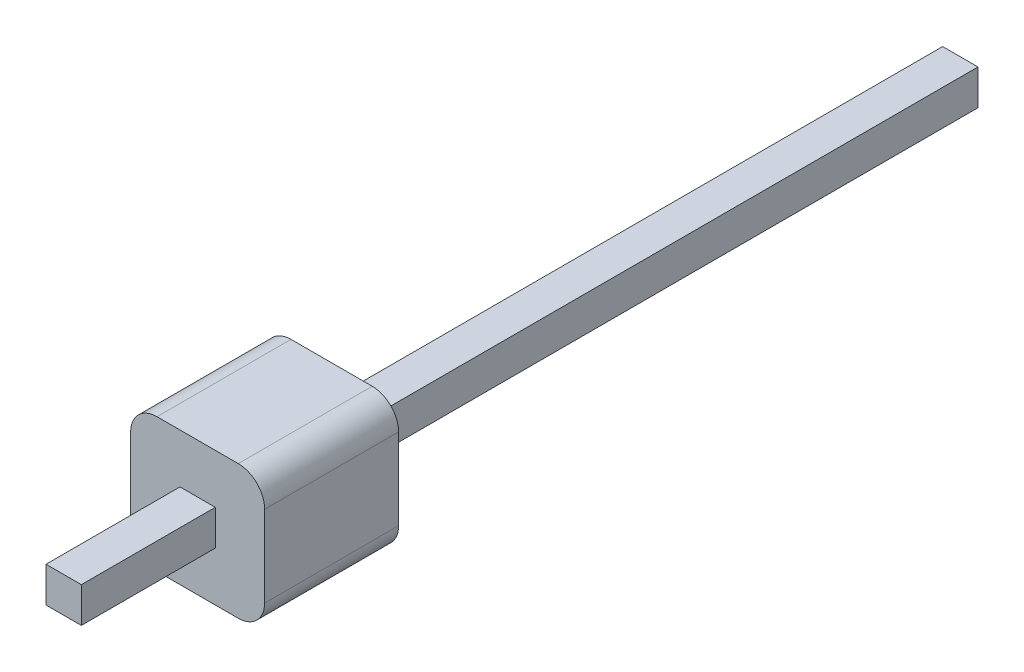
ISO-10303-21;
HEADER;
FILE_DESCRIPTION(('STEP AP214'),'2;1');
FILE_NAME('part.step','',(''),(''),'','','');
FILE_SCHEMA(('AUTOMOTIVE_DESIGN { 1 0 10303 214 1 1 1 1 }'));
ENDSEC;
DATA;
#1=APPLICATION_CONTEXT('core data for automotive mechanical design processes');
#2=APPLICATION_PROTOCOL_DEFINITION('international standard','automotive_design',2000,#1);
#3=PRODUCT_CONTEXT('',#1,'mechanical');
#4=PRODUCT('Part','Part','',(#3));
#5=PRODUCT_RELATED_PRODUCT_CATEGORY('part','',(#4));
#6=PRODUCT_DEFINITION_FORMATION('','',#4);
#7=PRODUCT_DEFINITION_CONTEXT('part definition',#1,'design');
#8=PRODUCT_DEFINITION('design','',#6,#7);
#9=PRODUCT_DEFINITION_SHAPE('','',#8);
#10=(LENGTH_UNIT() NAMED_UNIT(*) SI_UNIT(.MILLI.,.METRE.));
#11=(NAMED_UNIT(*) PLANE_ANGLE_UNIT() SI_UNIT($,.RADIAN.));
#12=(NAMED_UNIT(*) SI_UNIT($,.STERADIAN.) SOLID_ANGLE_UNIT());
#13=UNCERTAINTY_MEASURE_WITH_UNIT(LENGTH_MEASURE(1.E-05),#10,'distance_accuracy_value','');
#14=(GEOMETRIC_REPRESENTATION_CONTEXT(3) GLOBAL_UNCERTAINTY_ASSIGNED_CONTEXT((#13)) GLOBAL_UNIT_ASSIGNED_CONTEXT((#10,
#11,#12)) REPRESENTATION_CONTEXT('',''));
#15=CARTESIAN_POINT('',(0.,0.,0.));
#16=DIRECTION('',(0.,0.,1.));
#17=DIRECTION('',(1.,0.,0.));
#18=AXIS2_PLACEMENT_3D('',#15,#16,#17);
#19=CARTESIAN_POINT('',(-1.27,1.27,2.54));
#20=DIRECTION('',(0.,0.,1.));
#21=DIRECTION('',(1.,0.,0.));
#22=AXIS2_PLACEMENT_3D('',#19,#20,#21);
#23=PLANE('',#22);
#24=DIRECTION('',(1.,0.,0.));
#25=VECTOR('',#24,1.);
#26=CARTESIAN_POINT('',(-1.27,-1.27,2.54));
#27=LINE('',#26,#25);
#28=CARTESIAN_POINT('',(-0.769999999999999,-1.27,2.54));
#29=VERTEX_POINT('',#28);
#30=CARTESIAN_POINT('',(0.770000000000001,-1.27,2.54));
#31=VERTEX_POINT('',#30);
#32=EDGE_CURVE('E193',#29,#31,#27,.T.);
#33=ORIENTED_EDGE('',*,*,#32,.T.);
#34=CARTESIAN_POINT('',(0.770000000000001,-0.770000000000001,2.54));
#35=DIRECTION('',(0.,0.,1.));
#36=DIRECTION('',(1.,0.,0.));
#37=AXIS2_PLACEMENT_3D('',#34,#35,#36);
#38=CIRCLE('',#37,0.5);
#39=CARTESIAN_POINT('',(1.27,-0.77,2.54));
#40=VERTEX_POINT('',#39);
#41=EDGE_CURVE('E242',#31,#40,#38,.T.);
#42=ORIENTED_EDGE('',*,*,#41,.T.);
#43=DIRECTION('',(0.,1.,0.));
#44=VECTOR('',#43,1.);
#45=CARTESIAN_POINT('',(1.27,1.27,2.54));
#46=LINE('',#45,#44);
#47=CARTESIAN_POINT('',(1.27,0.77,2.54));
#48=VERTEX_POINT('',#47);
#49=EDGE_CURVE('E197',#40,#48,#46,.T.);
#50=ORIENTED_EDGE('',*,*,#49,.T.);
#51=CARTESIAN_POINT('',(0.77,0.77,2.54));
#52=DIRECTION('',(0.,0.,1.));
#53=DIRECTION('',(1.,0.,0.));
#54=AXIS2_PLACEMENT_3D('',#51,#52,#53);
#55=CIRCLE('',#54,0.5);
#56=CARTESIAN_POINT('',(0.77,1.27,2.54));
#57=VERTEX_POINT('',#56);
#58=EDGE_CURVE('E54',#48,#57,#55,.T.);
#59=ORIENTED_EDGE('',*,*,#58,.T.);
#60=DIRECTION('',(-1.,0.,0.));
#61=VECTOR('',#60,1.);
#62=CARTESIAN_POINT('',(-1.27,1.27,2.54));
#63=LINE('',#62,#61);
#64=CARTESIAN_POINT('',(-0.77,1.27,2.54));
#65=VERTEX_POINT('',#64);
#66=EDGE_CURVE('E199',#57,#65,#63,.T.);
#67=ORIENTED_EDGE('',*,*,#66,.T.);
#68=CARTESIAN_POINT('',(-0.77,0.769999999999999,2.54));
#69=DIRECTION('',(0.,0.,1.));
#70=DIRECTION('',(1.,0.,0.));
#71=AXIS2_PLACEMENT_3D('',#68,#69,#70);
#72=CIRCLE('',#71,0.5);
#73=CARTESIAN_POINT('',(-1.27,0.769999999999999,2.54));
#74=VERTEX_POINT('',#73);
#75=EDGE_CURVE('E238',#65,#74,#72,.T.);
#76=ORIENTED_EDGE('',*,*,#75,.T.);
#77=DIRECTION('',(0.,-1.,0.));
#78=VECTOR('',#77,1.);
#79=CARTESIAN_POINT('',(-1.27,1.27,2.54));
#80=LINE('',#79,#78);
#81=CARTESIAN_POINT('',(-1.27,-0.770000000000001,2.54));
#82=VERTEX_POINT('',#81);
#83=EDGE_CURVE('E190',#74,#82,#80,.T.);
#84=ORIENTED_EDGE('',*,*,#83,.T.);
#85=CARTESIAN_POINT('',(-0.769999999999999,-0.770000000000001,2.54));
#86=DIRECTION('',(0.,0.,1.));
#87=DIRECTION('',(1.,0.,0.));
#88=AXIS2_PLACEMENT_3D('',#85,#86,#87);
#89=CIRCLE('',#88,0.5);
#90=EDGE_CURVE('E240',#82,#29,#89,.T.);
#91=ORIENTED_EDGE('',*,*,#90,.T.);
#92=EDGE_LOOP('',(#33,#42,#50,#59,#67,#76,#84,#91));
#93=FACE_BOUND('',#92,.T.);
#94=DIRECTION('',(1.,0.,0.));
#95=VECTOR('',#94,1.);
#96=CARTESIAN_POINT('',(-1.27,0.335000000000001,2.54));
#97=LINE('',#96,#95);
#98=CARTESIAN_POINT('',(-0.335,0.335000000000001,2.54));
#99=VERTEX_POINT('',#98);
#100=CARTESIAN_POINT('',(0.335,0.335,2.54));
#101=VERTEX_POINT('',#100);
#102=EDGE_CURVE('E172',#99,#101,#97,.T.);
#103=ORIENTED_EDGE('',*,*,#102,.T.);
#104=DIRECTION('',(0.,-1.,0.));
#105=VECTOR('',#104,1.);
#106=CARTESIAN_POINT('',(0.335000000000001,1.27,2.54));
#107=LINE('',#106,#105);
#108=CARTESIAN_POINT('',(0.334999999999999,-0.334999999999999,2.54));
#109=VERTEX_POINT('',#108);
#110=EDGE_CURVE('E186',#101,#109,#107,.T.);
#111=ORIENTED_EDGE('',*,*,#110,.T.);
#112=DIRECTION('',(-1.,0.,0.));
#113=VECTOR('',#112,1.);
#114=CARTESIAN_POINT('',(-1.27,-0.335,2.54));
#115=LINE('',#114,#113);
#116=CARTESIAN_POINT('',(-0.335,-0.334999999999999,2.54));
#117=VERTEX_POINT('',#116);
#118=EDGE_CURVE('E183',#109,#117,#115,.T.);
#119=ORIENTED_EDGE('',*,*,#118,.T.);
#120=DIRECTION('',(0.,1.,0.));
#121=VECTOR('',#120,1.);
#122=CARTESIAN_POINT('',(-0.335,1.27,2.54));
#123=LINE('',#122,#121);
#124=EDGE_CURVE('E176',#117,#99,#123,.T.);
#125=ORIENTED_EDGE('',*,*,#124,.T.);
#126=EDGE_LOOP('',(#103,#111,#119,#125));
#127=FACE_BOUND('',#126,.T.);
#128=ADVANCED_FACE('F34',(#93,#127),#23,.T.);
#129=CARTESIAN_POINT('',(-1.27,1.27,0.));
#130=DIRECTION('',(0.,0.,1.));
#131=DIRECTION('',(1.,0.,0.));
#132=AXIS2_PLACEMENT_3D('',#129,#130,#131);
#133=PLANE('',#132);
#134=DIRECTION('',(0.,1.,0.));
#135=VECTOR('',#134,1.);
#136=CARTESIAN_POINT('',(1.27,1.27,0.));
#137=LINE('',#136,#135);
#138=CARTESIAN_POINT('',(1.27,-0.77,0.));
#139=VERTEX_POINT('',#138);
#140=CARTESIAN_POINT('',(1.27,0.77,0.));
#141=VERTEX_POINT('',#140);
#142=EDGE_CURVE('E207',#139,#141,#137,.T.);
#143=ORIENTED_EDGE('',*,*,#142,.F.);
#144=CARTESIAN_POINT('',(0.770000000000001,-0.770000000000001,0.));
#145=DIRECTION('',(0.,0.,1.));
#146=DIRECTION('',(1.,0.,0.));
#147=AXIS2_PLACEMENT_3D('',#144,#145,#146);
#148=CIRCLE('',#147,0.5);
#149=CARTESIAN_POINT('',(0.770000000000001,-1.27,0.));
#150=VERTEX_POINT('',#149);
#151=EDGE_CURVE('E230',#139,#150,#148,.F.);
#152=ORIENTED_EDGE('',*,*,#151,.T.);
#153=DIRECTION('',(1.,0.,0.));
#154=VECTOR('',#153,1.);
#155=CARTESIAN_POINT('',(-1.27,-1.27,0.));
#156=LINE('',#155,#154);
#157=CARTESIAN_POINT('',(-0.769999999999999,-1.27,0.));
#158=VERTEX_POINT('',#157);
#159=EDGE_CURVE('E204',#158,#150,#156,.T.);
#160=ORIENTED_EDGE('',*,*,#159,.F.);
#161=CARTESIAN_POINT('',(-0.769999999999999,-0.770000000000001,0.));
#162=DIRECTION('',(0.,0.,1.));
#163=DIRECTION('',(1.,0.,0.));
#164=AXIS2_PLACEMENT_3D('',#161,#162,#163);
#165=CIRCLE('',#164,0.5);
#166=CARTESIAN_POINT('',(-1.27,-0.770000000000001,0.));
#167=VERTEX_POINT('',#166);
#168=EDGE_CURVE('E228',#158,#167,#165,.F.);
#169=ORIENTED_EDGE('',*,*,#168,.T.);
#170=DIRECTION('',(0.,-1.,0.));
#171=VECTOR('',#170,1.);
#172=CARTESIAN_POINT('',(-1.27,1.27,0.));
#173=LINE('',#172,#171);
#174=CARTESIAN_POINT('',(-1.27,0.769999999999999,0.));
#175=VERTEX_POINT('',#174);
#176=EDGE_CURVE('E189',#175,#167,#173,.T.);
#177=ORIENTED_EDGE('',*,*,#176,.F.);
#178=CARTESIAN_POINT('',(-0.77,0.769999999999999,0.));
#179=DIRECTION('',(0.,0.,1.));
#180=DIRECTION('',(1.,0.,0.));
#181=AXIS2_PLACEMENT_3D('',#178,#179,#180);
#182=CIRCLE('',#181,0.5);
#183=CARTESIAN_POINT('',(-0.77,1.27,0.));
#184=VERTEX_POINT('',#183);
#185=EDGE_CURVE('E226',#175,#184,#182,.F.);
#186=ORIENTED_EDGE('',*,*,#185,.T.);
#187=DIRECTION('',(-1.,0.,0.));
#188=VECTOR('',#187,1.);
#189=CARTESIAN_POINT('',(-1.27,1.27,0.));
#190=LINE('',#189,#188);
#191=CARTESIAN_POINT('',(0.77,1.27,0.));
#192=VERTEX_POINT('',#191);
#193=EDGE_CURVE('E194',#192,#184,#190,.T.);
#194=ORIENTED_EDGE('',*,*,#193,.F.);
#195=CARTESIAN_POINT('',(0.77,0.77,0.));
#196=DIRECTION('',(0.,0.,1.));
#197=DIRECTION('',(1.,0.,0.));
#198=AXIS2_PLACEMENT_3D('',#195,#196,#197);
#199=CIRCLE('',#198,0.5);
#200=EDGE_CURVE('E224',#192,#141,#199,.F.);
#201=ORIENTED_EDGE('',*,*,#200,.T.);
#202=EDGE_LOOP('',(#143,#152,#160,#169,#177,#186,#194,#201));
#203=FACE_BOUND('',#202,.T.);
#204=DIRECTION('',(0.,-1.,0.));
#205=VECTOR('',#204,1.);
#206=CARTESIAN_POINT('',(0.335000000000001,1.27,0.));
#207=LINE('',#206,#205);
#208=CARTESIAN_POINT('',(0.335,0.335000000000001,0.));
#209=VERTEX_POINT('',#208);
#210=CARTESIAN_POINT('',(0.334999999999999,-0.334999999999999,0.));
#211=VERTEX_POINT('',#210);
#212=EDGE_CURVE('E171',#209,#211,#207,.T.);
#213=ORIENTED_EDGE('',*,*,#212,.F.);
#214=DIRECTION('',(1.,0.,0.));
#215=VECTOR('',#214,1.);
#216=CARTESIAN_POINT('',(-1.27,0.335000000000001,0.));
#217=LINE('',#216,#215);
#218=CARTESIAN_POINT('',(-0.335,0.335000000000001,0.));
#219=VERTEX_POINT('',#218);
#220=EDGE_CURVE('E201',#219,#209,#217,.T.);
#221=ORIENTED_EDGE('',*,*,#220,.F.);
#222=DIRECTION('',(0.,1.,0.));
#223=VECTOR('',#222,1.);
#224=CARTESIAN_POINT('',(-0.335,1.27,0.));
#225=LINE('',#224,#223);
#226=CARTESIAN_POINT('',(-0.335,-0.335,0.));
#227=VERTEX_POINT('',#226);
#228=EDGE_CURVE('E213',#227,#219,#225,.T.);
#229=ORIENTED_EDGE('',*,*,#228,.F.);
#230=DIRECTION('',(-1.,0.,0.));
#231=VECTOR('',#230,1.);
#232=CARTESIAN_POINT('',(-1.27,-0.334999999999999,0.));
#233=LINE('',#232,#231);
#234=EDGE_CURVE('E216',#211,#227,#233,.T.);
#235=ORIENTED_EDGE('',*,*,#234,.F.);
#236=EDGE_LOOP('',(#213,#221,#229,#235));
#237=FACE_BOUND('',#236,.T.);
#238=ADVANCED_FACE('F255',(#203,#237),#133,.F.);
#239=CARTESIAN_POINT('',(-1.27,1.27,2.54));
#240=DIRECTION('',(1.,0.,0.));
#241=DIRECTION('',(0.,1.,0.));
#242=AXIS2_PLACEMENT_3D('',#239,#240,#241);
#243=PLANE('',#242);
#244=ORIENTED_EDGE('',*,*,#176,.T.);
#245=DIRECTION('',(0.,0.,-1.));
#246=VECTOR('',#245,1.);
#247=CARTESIAN_POINT('',(-1.27,-0.770000000000001,2.54));
#248=LINE('',#247,#246);
#249=EDGE_CURVE('E247',#167,#82,#248,.F.);
#250=ORIENTED_EDGE('',*,*,#249,.T.);
#251=ORIENTED_EDGE('',*,*,#83,.F.);
#252=DIRECTION('',(0.,0.,-1.));
#253=VECTOR('',#252,1.);
#254=CARTESIAN_POINT('',(-1.27,0.769999999999999,2.54));
#255=LINE('',#254,#253);
#256=EDGE_CURVE('E244',#74,#175,#255,.T.);
#257=ORIENTED_EDGE('',*,*,#256,.T.);
#258=EDGE_LOOP('',(#244,#250,#251,#257));
#259=FACE_BOUND('',#258,.T.);
#260=ADVANCED_FACE('F264',(#259),#243,.F.);
#261=CARTESIAN_POINT('',(-1.27,-1.27,2.54));
#262=DIRECTION('',(0.,1.,0.));
#263=DIRECTION('',(-1.,0.,0.));
#264=AXIS2_PLACEMENT_3D('',#261,#262,#263);
#265=PLANE('',#264);
#266=ORIENTED_EDGE('',*,*,#159,.T.);
#267=DIRECTION('',(0.,0.,-1.));
#268=VECTOR('',#267,1.);
#269=CARTESIAN_POINT('',(0.770000000000001,-1.27,2.54));
#270=LINE('',#269,#268);
#271=EDGE_CURVE('E235',#150,#31,#270,.F.);
#272=ORIENTED_EDGE('',*,*,#271,.T.);
#273=ORIENTED_EDGE('',*,*,#32,.F.);
#274=DIRECTION('',(0.,0.,-1.));
#275=VECTOR('',#274,1.);
#276=CARTESIAN_POINT('',(-0.769999999999999,-1.27,2.54));
#277=LINE('',#276,#275);
#278=EDGE_CURVE('E232',#29,#158,#277,.T.);
#279=ORIENTED_EDGE('',*,*,#278,.T.);
#280=EDGE_LOOP('',(#266,#272,#273,#279));
#281=FACE_BOUND('',#280,.T.);
#282=ADVANCED_FACE('F274',(#281),#265,.F.);
#283=CARTESIAN_POINT('',(1.27,1.27,2.54));
#284=DIRECTION('',(-1.,0.,0.));
#285=DIRECTION('',(0.,-1.,0.));
#286=AXIS2_PLACEMENT_3D('',#283,#284,#285);
#287=PLANE('',#286);
#288=ORIENTED_EDGE('',*,*,#49,.F.);
#289=DIRECTION('',(0.,0.,-1.));
#290=VECTOR('',#289,1.);
#291=CARTESIAN_POINT('',(1.27,-0.77,2.54));
#292=LINE('',#291,#290);
#293=EDGE_CURVE('E221',#40,#139,#292,.T.);
#294=ORIENTED_EDGE('',*,*,#293,.T.);
#295=ORIENTED_EDGE('',*,*,#142,.T.);
#296=DIRECTION('',(0.,0.,-1.));
#297=VECTOR('',#296,1.);
#298=CARTESIAN_POINT('',(1.27,0.77,2.54));
#299=LINE('',#298,#297);
#300=EDGE_CURVE('E219',#141,#48,#299,.F.);
#301=ORIENTED_EDGE('',*,*,#300,.T.);
#302=EDGE_LOOP('',(#288,#294,#295,#301));
#303=FACE_BOUND('',#302,.T.);
#304=ADVANCED_FACE('F282',(#303),#287,.F.);
#305=CARTESIAN_POINT('',(-1.27,1.27,2.54));
#306=DIRECTION('',(0.,-1.,0.));
#307=DIRECTION('',(1.,0.,0.));
#308=AXIS2_PLACEMENT_3D('',#305,#306,#307);
#309=PLANE('',#308);
#310=ORIENTED_EDGE('',*,*,#193,.T.);
#311=DIRECTION('',(0.,0.,-1.));
#312=VECTOR('',#311,1.);
#313=CARTESIAN_POINT('',(-0.77,1.27,2.54));
#314=LINE('',#313,#312);
#315=EDGE_CURVE('E11',#184,#65,#314,.F.);
#316=ORIENTED_EDGE('',*,*,#315,.T.);
#317=ORIENTED_EDGE('',*,*,#66,.F.);
#318=DIRECTION('',(0.,0.,-1.));
#319=VECTOR('',#318,1.);
#320=CARTESIAN_POINT('',(0.77,1.27,2.54));
#321=LINE('',#320,#319);
#322=EDGE_CURVE('E42',#57,#192,#321,.T.);
#323=ORIENTED_EDGE('',*,*,#322,.T.);
#324=EDGE_LOOP('',(#310,#316,#317,#323));
#325=FACE_BOUND('',#324,.T.);
#326=ADVANCED_FACE('F251',(#325),#309,.F.);
#327=CARTESIAN_POINT('',(0.335,0.335000000000002,-11.92));
#328=DIRECTION('',(0.,0.,-1.));
#329=DIRECTION('',(-1.,0.,0.));
#330=AXIS2_PLACEMENT_3D('',#327,#328,#329);
#331=PLANE('',#330);
#332=DIRECTION('',(0.,-1.,0.));
#333=VECTOR('',#332,1.);
#334=CARTESIAN_POINT('',(0.335,0.335000000000002,-11.92));
#335=LINE('',#334,#333);
#336=CARTESIAN_POINT('',(0.335,0.335000000000002,-11.92));
#337=VERTEX_POINT('',#336);
#338=CARTESIAN_POINT('',(0.334999999999999,-0.334999999999998,-11.92));
#339=VERTEX_POINT('',#338);
#340=EDGE_CURVE('E158',#337,#339,#335,.T.);
#341=ORIENTED_EDGE('',*,*,#340,.T.);
#342=DIRECTION('',(-1.,0.,0.));
#343=VECTOR('',#342,1.);
#344=CARTESIAN_POINT('',(0.334999999999999,-0.334999999999998,-11.92));
#345=LINE('',#344,#343);
#346=CARTESIAN_POINT('',(-0.335,-0.334999999999998,-11.92));
#347=VERTEX_POINT('',#346);
#348=EDGE_CURVE('E147',#339,#347,#345,.T.);
#349=ORIENTED_EDGE('',*,*,#348,.T.);
#350=DIRECTION('',(0.,1.,0.));
#351=VECTOR('',#350,1.);
#352=CARTESIAN_POINT('',(-0.335,0.335000000000002,-11.92));
#353=LINE('',#352,#351);
#354=CARTESIAN_POINT('',(-0.335,0.335000000000002,-11.92));
#355=VERTEX_POINT('',#354);
#356=EDGE_CURVE('E157',#347,#355,#353,.T.);
#357=ORIENTED_EDGE('',*,*,#356,.T.);
#358=DIRECTION('',(1.,0.,0.));
#359=VECTOR('',#358,1.);
#360=CARTESIAN_POINT('',(0.335,0.335000000000002,-11.92));
#361=LINE('',#360,#359);
#362=EDGE_CURVE('E163',#355,#337,#361,.T.);
#363=ORIENTED_EDGE('',*,*,#362,.T.);
#364=EDGE_LOOP('',(#341,#349,#357,#363));
#365=FACE_BOUND('',#364,.T.);
#366=ADVANCED_FACE('F161',(#365),#331,.T.);
#367=CARTESIAN_POINT('',(0.335,0.335000000000002,-11.92));
#368=DIRECTION('',(0.,-1.,0.));
#369=DIRECTION('',(1.,0.,0.));
#370=AXIS2_PLACEMENT_3D('',#367,#368,#369);
#371=PLANE('',#370);
#372=DIRECTION('',(0.,0.,1.));
#373=VECTOR('',#372,1.);
#374=CARTESIAN_POINT('',(-0.335,0.335000000000002,-11.92));
#375=LINE('',#374,#373);
#376=EDGE_CURVE('E454',#355,#219,#375,.T.);
#377=ORIENTED_EDGE('',*,*,#376,.T.);
#378=ORIENTED_EDGE('',*,*,#220,.T.);
#379=DIRECTION('',(0.,0.,1.));
#380=VECTOR('',#379,1.);
#381=CARTESIAN_POINT('',(0.335,0.335000000000002,-11.92));
#382=LINE('',#381,#380);
#383=EDGE_CURVE('E457',#337,#209,#382,.T.);
#384=ORIENTED_EDGE('',*,*,#383,.F.);
#385=ORIENTED_EDGE('',*,*,#362,.F.);
#386=EDGE_LOOP('',(#377,#378,#384,#385));
#387=FACE_BOUND('',#386,.T.);
#388=ADVANCED_FACE('F351',(#387),#371,.F.);
#389=CARTESIAN_POINT('',(-0.335,0.335000000000002,-11.92));
#390=DIRECTION('',(1.,0.,0.));
#391=DIRECTION('',(0.,0.,-1.));
#392=AXIS2_PLACEMENT_3D('',#389,#390,#391);
#393=PLANE('',#392);
#394=DIRECTION('',(0.,0.,1.));
#395=VECTOR('',#394,1.);
#396=CARTESIAN_POINT('',(-0.335,-0.334999999999998,-11.92));
#397=LINE('',#396,#395);
#398=EDGE_CURVE('E154',#347,#227,#397,.T.);
#399=ORIENTED_EDGE('',*,*,#398,.T.);
#400=ORIENTED_EDGE('',*,*,#228,.T.);
#401=ORIENTED_EDGE('',*,*,#376,.F.);
#402=ORIENTED_EDGE('',*,*,#356,.F.);
#403=EDGE_LOOP('',(#399,#400,#401,#402));
#404=FACE_BOUND('',#403,.T.);
#405=ADVANCED_FACE('F361',(#404),#393,.F.);
#406=CARTESIAN_POINT('',(0.334999999999999,-0.334999999999998,-11.92));
#407=DIRECTION('',(0.,1.,0.));
#408=DIRECTION('',(0.,0.,1.));
#409=AXIS2_PLACEMENT_3D('',#406,#407,#408);
#410=PLANE('',#409);
#411=DIRECTION('',(0.,0.,1.));
#412=VECTOR('',#411,1.);
#413=CARTESIAN_POINT('',(0.334999999999999,-0.334999999999998,-11.92));
#414=LINE('',#413,#412);
#415=EDGE_CURVE('E152',#339,#211,#414,.T.);
#416=ORIENTED_EDGE('',*,*,#415,.T.);
#417=ORIENTED_EDGE('',*,*,#234,.T.);
#418=ORIENTED_EDGE('',*,*,#398,.F.);
#419=ORIENTED_EDGE('',*,*,#348,.F.);
#420=EDGE_LOOP('',(#416,#417,#418,#419));
#421=FACE_BOUND('',#420,.T.);
#422=ADVANCED_FACE('F149',(#421),#410,.F.);
#423=CARTESIAN_POINT('',(0.335,0.335000000000002,-11.92));
#424=DIRECTION('',(-1.,0.,0.));
#425=DIRECTION('',(0.,-1.,0.));
#426=AXIS2_PLACEMENT_3D('',#423,#424,#425);
#427=PLANE('',#426);
#428=ORIENTED_EDGE('',*,*,#383,.T.);
#429=ORIENTED_EDGE('',*,*,#212,.T.);
#430=ORIENTED_EDGE('',*,*,#415,.F.);
#431=ORIENTED_EDGE('',*,*,#340,.F.);
#432=EDGE_LOOP('',(#428,#429,#430,#431));
#433=FACE_BOUND('',#432,.T.);
#434=ADVANCED_FACE('F170',(#433),#427,.F.);
#435=ORIENTED_EDGE('',*,*,#110,.F.);
#436=CARTESIAN_POINT('',(0.335,0.335,5.08));
#437=VERTEX_POINT('',#436);
#438=EDGE_CURVE('E460',#101,#437,#382,.T.);
#439=ORIENTED_EDGE('',*,*,#438,.T.);
#440=DIRECTION('',(0.,-1.,0.));
#441=VECTOR('',#440,1.);
#442=CARTESIAN_POINT('',(0.335,0.335,5.08));
#443=LINE('',#442,#441);
#444=CARTESIAN_POINT('',(0.334999999999999,-0.335,5.08));
#445=VERTEX_POINT('',#444);
#446=EDGE_CURVE('E469',#437,#445,#443,.T.);
#447=ORIENTED_EDGE('',*,*,#446,.T.);
#448=EDGE_CURVE('E173',#109,#445,#414,.T.);
#449=ORIENTED_EDGE('',*,*,#448,.F.);
#450=EDGE_LOOP('',(#435,#439,#447,#449));
#451=FACE_BOUND('',#450,.T.);
#452=ADVANCED_FACE('F295',(#451),#427,.F.);
#453=ORIENTED_EDGE('',*,*,#118,.F.);
#454=ORIENTED_EDGE('',*,*,#448,.T.);
#455=DIRECTION('',(-1.,0.,0.));
#456=VECTOR('',#455,1.);
#457=CARTESIAN_POINT('',(0.334999999999999,-0.335,5.08));
#458=LINE('',#457,#456);
#459=CARTESIAN_POINT('',(-0.335,-0.335,5.08));
#460=VERTEX_POINT('',#459);
#461=EDGE_CURVE('E466',#445,#460,#458,.T.);
#462=ORIENTED_EDGE('',*,*,#461,.T.);
#463=EDGE_CURVE('E455',#117,#460,#397,.T.);
#464=ORIENTED_EDGE('',*,*,#463,.F.);
#465=EDGE_LOOP('',(#453,#454,#462,#464));
#466=FACE_BOUND('',#465,.T.);
#467=ADVANCED_FACE('F358',(#466),#410,.F.);
#468=ORIENTED_EDGE('',*,*,#124,.F.);
#469=ORIENTED_EDGE('',*,*,#463,.T.);
#470=DIRECTION('',(0.,1.,0.));
#471=VECTOR('',#470,1.);
#472=CARTESIAN_POINT('',(-0.335,0.335,5.08));
#473=LINE('',#472,#471);
#474=CARTESIAN_POINT('',(-0.335,0.335,5.08));
#475=VERTEX_POINT('',#474);
#476=EDGE_CURVE('E463',#460,#475,#473,.T.);
#477=ORIENTED_EDGE('',*,*,#476,.T.);
#478=EDGE_CURVE('E456',#99,#475,#375,.T.);
#479=ORIENTED_EDGE('',*,*,#478,.F.);
#480=EDGE_LOOP('',(#468,#469,#477,#479));
#481=FACE_BOUND('',#480,.T.);
#482=ADVANCED_FACE('F348',(#481),#393,.F.);
#483=ORIENTED_EDGE('',*,*,#102,.F.);
#484=ORIENTED_EDGE('',*,*,#478,.T.);
#485=DIRECTION('',(1.,0.,0.));
#486=VECTOR('',#485,1.);
#487=CARTESIAN_POINT('',(0.335,0.335,5.08));
#488=LINE('',#487,#486);
#489=EDGE_CURVE('E167',#475,#437,#488,.T.);
#490=ORIENTED_EDGE('',*,*,#489,.T.);
#491=ORIENTED_EDGE('',*,*,#438,.F.);
#492=EDGE_LOOP('',(#483,#484,#490,#491));
#493=FACE_BOUND('',#492,.T.);
#494=ADVANCED_FACE('F339',(#493),#371,.F.);
#495=CARTESIAN_POINT('',(0.335,0.335,5.08));
#496=DIRECTION('',(0.,0.,-1.));
#497=DIRECTION('',(-1.,0.,0.));
#498=AXIS2_PLACEMENT_3D('',#495,#496,#497);
#499=PLANE('',#498);
#500=ORIENTED_EDGE('',*,*,#446,.F.);
#501=ORIENTED_EDGE('',*,*,#489,.F.);
#502=ORIENTED_EDGE('',*,*,#476,.F.);
#503=ORIENTED_EDGE('',*,*,#461,.F.);
#504=EDGE_LOOP('',(#500,#501,#502,#503));
#505=FACE_BOUND('',#504,.T.);
#506=ADVANCED_FACE('F308',(#505),#499,.F.);
#507=CARTESIAN_POINT('',(0.770000000000001,-0.770000000000001,2.54));
#508=DIRECTION('',(0.,0.,-1.));
#509=DIRECTION('',(-1.,0.,0.));
#510=AXIS2_PLACEMENT_3D('',#507,#508,#509);
#511=CYLINDRICAL_SURFACE('',#510,0.5);
#512=ORIENTED_EDGE('',*,*,#41,.F.);
#513=ORIENTED_EDGE('',*,*,#271,.F.);
#514=ORIENTED_EDGE('',*,*,#151,.F.);
#515=ORIENTED_EDGE('',*,*,#293,.F.);
#516=EDGE_LOOP('',(#512,#513,#514,#515));
#517=FACE_BOUND('',#516,.T.);
#518=ADVANCED_FACE('F279',(#517),#511,.T.);
#519=CARTESIAN_POINT('',(-0.769999999999999,-0.770000000000001,2.54));
#520=DIRECTION('',(0.,0.,-1.));
#521=DIRECTION('',(-1.,0.,0.));
#522=AXIS2_PLACEMENT_3D('',#519,#520,#521);
#523=CYLINDRICAL_SURFACE('',#522,0.5);
#524=ORIENTED_EDGE('',*,*,#90,.F.);
#525=ORIENTED_EDGE('',*,*,#249,.F.);
#526=ORIENTED_EDGE('',*,*,#168,.F.);
#527=ORIENTED_EDGE('',*,*,#278,.F.);
#528=EDGE_LOOP('',(#524,#525,#526,#527));
#529=FACE_BOUND('',#528,.T.);
#530=ADVANCED_FACE('F271',(#529),#523,.T.);
#531=CARTESIAN_POINT('',(-0.77,0.769999999999999,2.54));
#532=DIRECTION('',(0.,0.,-1.));
#533=DIRECTION('',(-1.,0.,0.));
#534=AXIS2_PLACEMENT_3D('',#531,#532,#533);
#535=CYLINDRICAL_SURFACE('',#534,0.5);
#536=ORIENTED_EDGE('',*,*,#75,.F.);
#537=ORIENTED_EDGE('',*,*,#315,.F.);
#538=ORIENTED_EDGE('',*,*,#185,.F.);
#539=ORIENTED_EDGE('',*,*,#256,.F.);
#540=EDGE_LOOP('',(#536,#537,#538,#539));
#541=FACE_BOUND('',#540,.T.);
#542=ADVANCED_FACE('F261',(#541),#535,.T.);
#543=CARTESIAN_POINT('',(0.77,0.77,2.54));
#544=DIRECTION('',(0.,0.,-1.));
#545=DIRECTION('',(-1.,0.,0.));
#546=AXIS2_PLACEMENT_3D('',#543,#544,#545);
#547=CYLINDRICAL_SURFACE('',#546,0.5);
#548=ORIENTED_EDGE('',*,*,#58,.F.);
#549=ORIENTED_EDGE('',*,*,#300,.F.);
#550=ORIENTED_EDGE('',*,*,#200,.F.);
#551=ORIENTED_EDGE('',*,*,#322,.F.);
#552=EDGE_LOOP('',(#548,#549,#550,#551));
#553=FACE_BOUND('',#552,.T.);
#554=ADVANCED_FACE('F36',(#553),#547,.T.);
#555=CLOSED_SHELL('',(#128,#238,#260,#282,#304,#326,#366,#388,#405,#422,#434,#452,#467,#482,
#494,#506,#518,#530,#542,#554));
#556=MANIFOLD_SOLID_BREP('B2',#555);
#557=ADVANCED_BREP_SHAPE_REPRESENTATION('',(#18,#556),#14);
#558=SHAPE_DEFINITION_REPRESENTATION(#9,#557);
ENDSEC;
END-ISO-10303-21;
